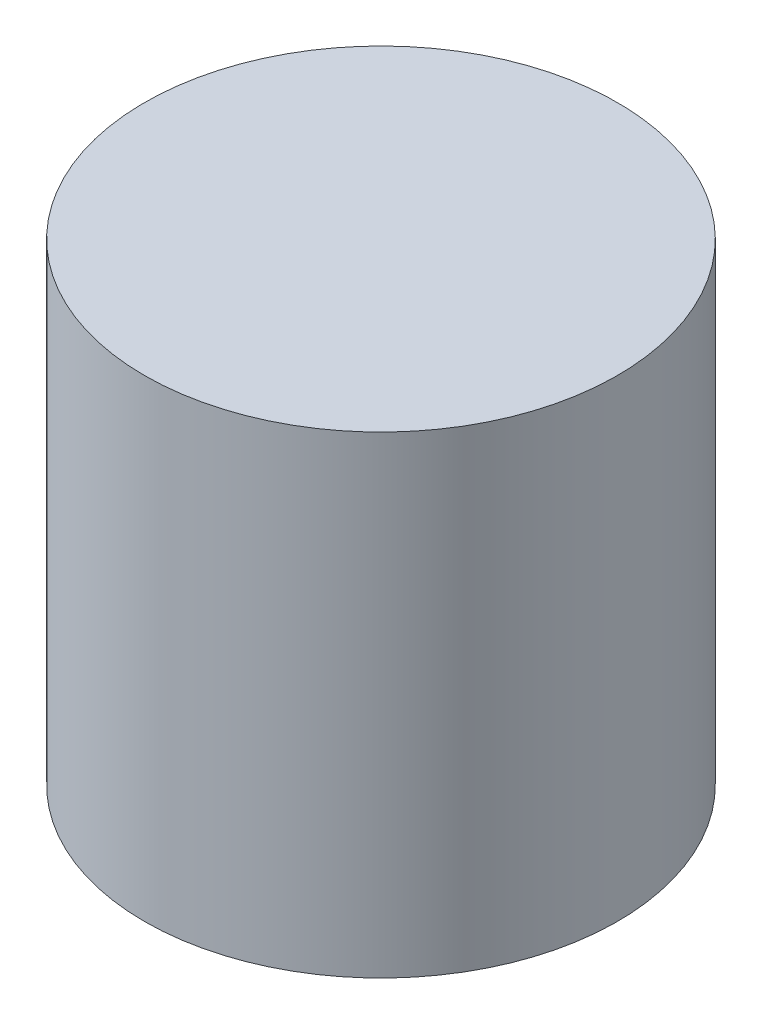
ISO-10303-21;
HEADER;
FILE_DESCRIPTION(('STEP AP214'),'2;1');
FILE_NAME('part.step','',(''),(''),'','','');
FILE_SCHEMA(('AUTOMOTIVE_DESIGN { 1 0 10303 214 1 1 1 1 }'));
ENDSEC;
DATA;
#1=APPLICATION_CONTEXT('core data for automotive mechanical design processes');
#2=APPLICATION_PROTOCOL_DEFINITION('international standard','automotive_design',2000,#1);
#3=PRODUCT_CONTEXT('',#1,'mechanical');
#4=PRODUCT('Part','Part','',(#3));
#5=PRODUCT_RELATED_PRODUCT_CATEGORY('part','',(#4));
#6=PRODUCT_DEFINITION_FORMATION('','',#4);
#7=PRODUCT_DEFINITION_CONTEXT('part definition',#1,'design');
#8=PRODUCT_DEFINITION('design','',#6,#7);
#9=PRODUCT_DEFINITION_SHAPE('','',#8);
#10=(LENGTH_UNIT() NAMED_UNIT(*) SI_UNIT(.MILLI.,.METRE.));
#11=(NAMED_UNIT(*) PLANE_ANGLE_UNIT() SI_UNIT($,.RADIAN.));
#12=(NAMED_UNIT(*) SI_UNIT($,.STERADIAN.) SOLID_ANGLE_UNIT());
#13=UNCERTAINTY_MEASURE_WITH_UNIT(LENGTH_MEASURE(1.E-05),#10,'distance_accuracy_value','');
#14=(GEOMETRIC_REPRESENTATION_CONTEXT(3) GLOBAL_UNCERTAINTY_ASSIGNED_CONTEXT((#13)) GLOBAL_UNIT_ASSIGNED_CONTEXT((#10,
#11,#12)) REPRESENTATION_CONTEXT('',''));
#15=CARTESIAN_POINT('',(0.,0.,0.));
#16=DIRECTION('',(0.,0.,1.));
#17=DIRECTION('',(1.,0.,0.));
#18=AXIS2_PLACEMENT_3D('',#15,#16,#17);
#19=CARTESIAN_POINT('',(0.,2.54,0.));
#20=DIRECTION('',(0.,-1.,0.));
#21=DIRECTION('',(0.,0.,-1.));
#22=AXIS2_PLACEMENT_3D('',#19,#20,#21);
#23=CYLINDRICAL_SURFACE('',#22,1.27);
#24=CARTESIAN_POINT('',(0.,2.54,0.));
#25=DIRECTION('',(0.,1.,0.));
#26=DIRECTION('',(0.,0.,1.));
#27=AXIS2_PLACEMENT_3D('',#24,#25,#26);
#28=CIRCLE('',#27,1.27);
#29=CARTESIAN_POINT('',(0.,2.54,1.27));
#30=VERTEX_POINT('',#29);
#31=EDGE_CURVE('E10',#30,#30,#28,.T.);
#32=ORIENTED_EDGE('',*,*,#31,.F.);
#33=EDGE_LOOP('',(#32));
#34=FACE_BOUND('',#33,.T.);
#35=CARTESIAN_POINT('',(0.,0.,0.));
#36=DIRECTION('',(0.,1.,0.));
#37=DIRECTION('',(0.,0.,1.));
#38=AXIS2_PLACEMENT_3D('',#35,#36,#37);
#39=CIRCLE('',#38,1.27);
#40=CARTESIAN_POINT('',(0.,0.,1.27));
#41=VERTEX_POINT('',#40);
#42=EDGE_CURVE('E34',#41,#41,#39,.T.);
#43=ORIENTED_EDGE('',*,*,#42,.T.);
#44=EDGE_LOOP('',(#43));
#45=FACE_BOUND('',#44,.T.);
#46=ADVANCED_FACE('F31',(#34,#45),#23,.T.);
#47=CARTESIAN_POINT('',(0.,2.54,0.));
#48=DIRECTION('',(0.,1.,0.));
#49=DIRECTION('',(0.,0.,1.));
#50=AXIS2_PLACEMENT_3D('',#47,#48,#49);
#51=PLANE('',#50);
#52=ORIENTED_EDGE('',*,*,#31,.T.);
#53=EDGE_LOOP('',(#52));
#54=FACE_BOUND('',#53,.T.);
#55=ADVANCED_FACE('F46',(#54),#51,.T.);
#56=CARTESIAN_POINT('',(0.,0.,0.));
#57=DIRECTION('',(0.,1.,0.));
#58=DIRECTION('',(0.,0.,1.));
#59=AXIS2_PLACEMENT_3D('',#56,#57,#58);
#60=PLANE('',#59);
#61=ORIENTED_EDGE('',*,*,#42,.F.);
#62=EDGE_LOOP('',(#61));
#63=FACE_BOUND('',#62,.T.);
#64=ADVANCED_FACE('F44',(#63),#60,.F.);
#65=CLOSED_SHELL('',(#46,#55,#64));
#66=MANIFOLD_SOLID_BREP('B2',#65);
#67=ADVANCED_BREP_SHAPE_REPRESENTATION('',(#18,#66),#14);
#68=SHAPE_DEFINITION_REPRESENTATION(#9,#67);
ENDSEC;
END-ISO-10303-21;
